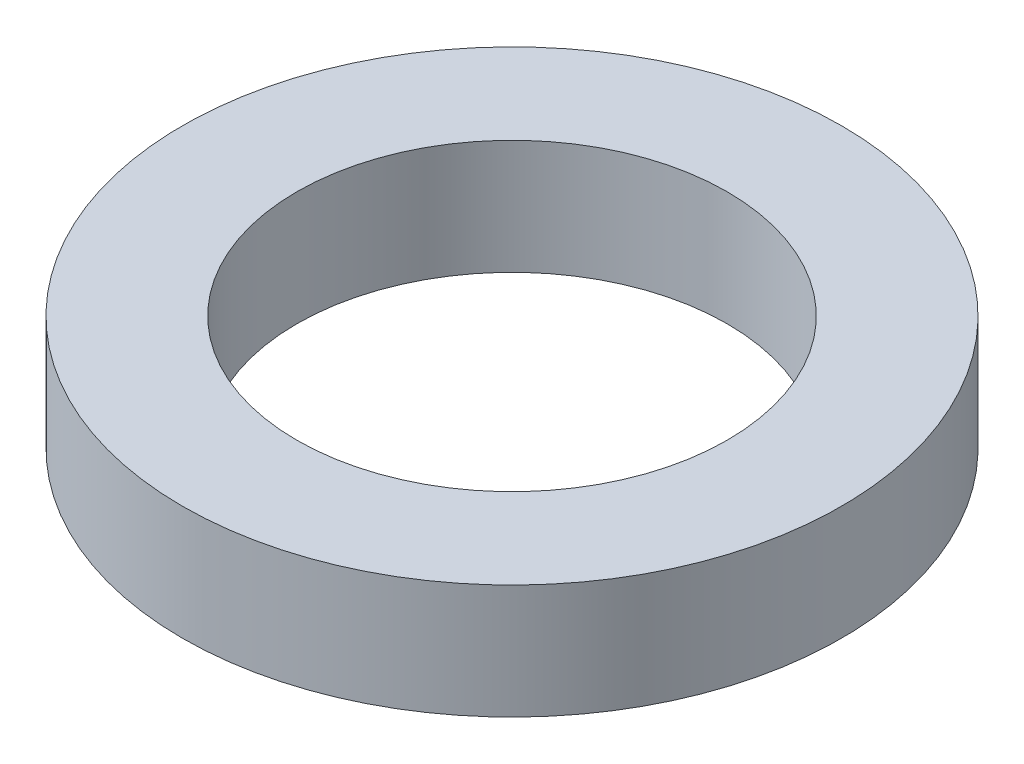
ISO-10303-21;
HEADER;
FILE_DESCRIPTION(('STEP AP214'),'2;1');
FILE_NAME('part.step','',(''),(''),'','','');
FILE_SCHEMA(('AUTOMOTIVE_DESIGN { 1 0 10303 214 1 1 1 1 }'));
ENDSEC;
DATA;
#1=APPLICATION_CONTEXT('core data for automotive mechanical design processes');
#2=APPLICATION_PROTOCOL_DEFINITION('international standard','automotive_design',2000,#1);
#3=PRODUCT_CONTEXT('',#1,'mechanical');
#4=PRODUCT('Part','Part','',(#3));
#5=PRODUCT_RELATED_PRODUCT_CATEGORY('part','',(#4));
#6=PRODUCT_DEFINITION_FORMATION('','',#4);
#7=PRODUCT_DEFINITION_CONTEXT('part definition',#1,'design');
#8=PRODUCT_DEFINITION('design','',#6,#7);
#9=PRODUCT_DEFINITION_SHAPE('','',#8);
#10=(LENGTH_UNIT() NAMED_UNIT(*) SI_UNIT(.MILLI.,.METRE.));
#11=(NAMED_UNIT(*) PLANE_ANGLE_UNIT() SI_UNIT($,.RADIAN.));
#12=(NAMED_UNIT(*) SI_UNIT($,.STERADIAN.) SOLID_ANGLE_UNIT());
#13=UNCERTAINTY_MEASURE_WITH_UNIT(LENGTH_MEASURE(1.E-05),#10,'distance_accuracy_value','');
#14=(GEOMETRIC_REPRESENTATION_CONTEXT(3) GLOBAL_UNCERTAINTY_ASSIGNED_CONTEXT((#13)) GLOBAL_UNIT_ASSIGNED_CONTEXT((#10,
#11,#12)) REPRESENTATION_CONTEXT('',''));
#15=CARTESIAN_POINT('',(0.,0.,0.));
#16=DIRECTION('',(0.,0.,1.));
#17=DIRECTION('',(1.,0.,0.));
#18=AXIS2_PLACEMENT_3D('',#15,#16,#17);
#19=CARTESIAN_POINT('',(0.,15.524,0.));
#20=DIRECTION('',(0.,1.,0.));
#21=DIRECTION('',(0.,0.,1.));
#22=AXIS2_PLACEMENT_3D('',#19,#20,#21);
#23=PLANE('',#22);
#24=CARTESIAN_POINT('',(0.,15.524,0.));
#25=DIRECTION('',(0.,1.,0.));
#26=DIRECTION('',(0.,0.,1.));
#27=AXIS2_PLACEMENT_3D('',#24,#25,#26);
#28=CIRCLE('',#27,44.734);
#29=CARTESIAN_POINT('',(0.,15.524,-44.734));
#30=VERTEX_POINT('',#29);
#31=EDGE_CURVE('E10',#30,#30,#28,.T.);
#32=ORIENTED_EDGE('',*,*,#31,.T.);
#33=EDGE_LOOP('',(#32));
#34=FACE_BOUND('',#33,.T.);
#35=CARTESIAN_POINT('',(0.,15.524,0.));
#36=DIRECTION('',(0.,1.,0.));
#37=DIRECTION('',(0.,0.,1.));
#38=AXIS2_PLACEMENT_3D('',#35,#36,#37);
#39=CIRCLE('',#38,29.21);
#40=CARTESIAN_POINT('',(0.,15.524,-29.21));
#41=VERTEX_POINT('',#40);
#42=EDGE_CURVE('E40',#41,#41,#39,.T.);
#43=ORIENTED_EDGE('',*,*,#42,.F.);
#44=EDGE_LOOP('',(#43));
#45=FACE_BOUND('',#44,.T.);
#46=ADVANCED_FACE('F29',(#34,#45),#23,.T.);
#47=CARTESIAN_POINT('',(0.,0.,0.));
#48=DIRECTION('',(0.,1.,0.));
#49=DIRECTION('',(0.,0.,1.));
#50=AXIS2_PLACEMENT_3D('',#47,#48,#49);
#51=PLANE('',#50);
#52=CARTESIAN_POINT('',(0.,0.,0.));
#53=DIRECTION('',(0.,1.,0.));
#54=DIRECTION('',(0.,0.,1.));
#55=AXIS2_PLACEMENT_3D('',#52,#53,#54);
#56=CIRCLE('',#55,44.734);
#57=CARTESIAN_POINT('',(0.,0.,-44.734));
#58=VERTEX_POINT('',#57);
#59=EDGE_CURVE('E33',#58,#58,#56,.T.);
#60=ORIENTED_EDGE('',*,*,#59,.F.);
#61=EDGE_LOOP('',(#60));
#62=FACE_BOUND('',#61,.T.);
#63=CARTESIAN_POINT('',(0.,0.,0.));
#64=DIRECTION('',(0.,1.,0.));
#65=DIRECTION('',(0.,0.,1.));
#66=AXIS2_PLACEMENT_3D('',#63,#64,#65);
#67=CIRCLE('',#66,29.21);
#68=CARTESIAN_POINT('',(0.,0.,-29.21));
#69=VERTEX_POINT('',#68);
#70=EDGE_CURVE('E42',#69,#69,#67,.T.);
#71=ORIENTED_EDGE('',*,*,#70,.T.);
#72=EDGE_LOOP('',(#71));
#73=FACE_BOUND('',#72,.T.);
#74=ADVANCED_FACE('F52',(#62,#73),#51,.F.);
#75=CARTESIAN_POINT('',(0.,15.524,0.));
#76=DIRECTION('',(0.,-1.,0.));
#77=DIRECTION('',(0.,0.,-1.));
#78=AXIS2_PLACEMENT_3D('',#75,#76,#77);
#79=CYLINDRICAL_SURFACE('',#78,44.734);
#80=CARTESIAN_POINT('',(0.,15.524,-44.734));
#81=CARTESIAN_POINT('',(0.,15.3622916666667,-44.734));
#82=CARTESIAN_POINT('',(0.,15.2005833333333,-44.734));
#83=CARTESIAN_POINT('',(0.,14.8771666666667,-44.734));
#84=CARTESIAN_POINT('',(0.,14.7154583333333,-44.734));
#85=CARTESIAN_POINT('',(0.,14.3920416666667,-44.734));
#86=CARTESIAN_POINT('',(0.,14.2303333333333,-44.734));
#87=CARTESIAN_POINT('',(0.,13.9069166666667,-44.734));
#88=CARTESIAN_POINT('',(0.,13.7452083333333,-44.734));
#89=CARTESIAN_POINT('',(0.,13.4217916666667,-44.734));
#90=CARTESIAN_POINT('',(0.,13.2600833333333,-44.734));
#91=CARTESIAN_POINT('',(0.,12.9366666666667,-44.734));
#92=CARTESIAN_POINT('',(0.,12.7749583333333,-44.734));
#93=CARTESIAN_POINT('',(0.,12.4515416666667,-44.734));
#94=CARTESIAN_POINT('',(0.,12.2898333333333,-44.734));
#95=CARTESIAN_POINT('',(0.,11.9664166666667,-44.734));
#96=CARTESIAN_POINT('',(0.,11.8047083333333,-44.734));
#97=CARTESIAN_POINT('',(0.,11.4812916666667,-44.734));
#98=CARTESIAN_POINT('',(0.,11.3195833333333,-44.734));
#99=CARTESIAN_POINT('',(0.,10.9961666666667,-44.734));
#100=CARTESIAN_POINT('',(0.,10.8344583333333,-44.734));
#101=CARTESIAN_POINT('',(0.,10.5110416666667,-44.734));
#102=CARTESIAN_POINT('',(0.,10.3493333333333,-44.734));
#103=CARTESIAN_POINT('',(0.,10.0259166666667,-44.734));
#104=CARTESIAN_POINT('',(0.,9.86420833333333,-44.734));
#105=CARTESIAN_POINT('',(0.,9.54079166666667,-44.734));
#106=CARTESIAN_POINT('',(0.,9.37908333333333,-44.734));
#107=CARTESIAN_POINT('',(0.,9.05566666666667,-44.734));
#108=CARTESIAN_POINT('',(0.,8.89395833333333,-44.734));
#109=CARTESIAN_POINT('',(0.,8.57054166666667,-44.734));
#110=CARTESIAN_POINT('',(0.,8.40883333333333,-44.734));
#111=CARTESIAN_POINT('',(0.,8.08541666666666,-44.734));
#112=CARTESIAN_POINT('',(0.,7.92370833333333,-44.734));
#113=CARTESIAN_POINT('',(0.,7.60029166666667,-44.734));
#114=CARTESIAN_POINT('',(0.,7.43858333333333,-44.734));
#115=CARTESIAN_POINT('',(0.,7.11516666666667,-44.734));
#116=CARTESIAN_POINT('',(0.,6.95345833333333,-44.734));
#117=CARTESIAN_POINT('',(0.,6.63004166666667,-44.734));
#118=CARTESIAN_POINT('',(0.,6.46833333333333,-44.734));
#119=CARTESIAN_POINT('',(0.,6.14491666666667,-44.734));
#120=CARTESIAN_POINT('',(0.,5.98320833333333,-44.734));
#121=CARTESIAN_POINT('',(0.,5.65979166666667,-44.734));
#122=CARTESIAN_POINT('',(0.,5.49808333333333,-44.734));
#123=CARTESIAN_POINT('',(0.,5.17466666666667,-44.734));
#124=CARTESIAN_POINT('',(0.,5.01295833333333,-44.734));
#125=CARTESIAN_POINT('',(0.,4.68954166666667,-44.734));
#126=CARTESIAN_POINT('',(0.,4.52783333333333,-44.734));
#127=CARTESIAN_POINT('',(0.,4.20441666666667,-44.734));
#128=CARTESIAN_POINT('',(0.,4.04270833333333,-44.734));
#129=CARTESIAN_POINT('',(0.,3.71929166666667,-44.734));
#130=CARTESIAN_POINT('',(0.,3.55758333333333,-44.734));
#131=CARTESIAN_POINT('',(0.,3.23416666666667,-44.734));
#132=CARTESIAN_POINT('',(0.,3.07245833333333,-44.734));
#133=CARTESIAN_POINT('',(0.,2.74904166666667,-44.734));
#134=CARTESIAN_POINT('',(0.,2.58733333333333,-44.734));
#135=CARTESIAN_POINT('',(0.,2.26391666666667,-44.734));
#136=CARTESIAN_POINT('',(0.,2.10220833333333,-44.734));
#137=CARTESIAN_POINT('',(0.,1.77879166666667,-44.734));
#138=CARTESIAN_POINT('',(0.,1.61708333333333,-44.734));
#139=CARTESIAN_POINT('',(0.,1.29366666666667,-44.734));
#140=CARTESIAN_POINT('',(0.,1.13195833333333,-44.734));
#141=CARTESIAN_POINT('',(0.,0.808541666666665,-44.734));
#142=CARTESIAN_POINT('',(0.,0.646833333333331,-44.734));
#143=CARTESIAN_POINT('',(0.,0.323416666666665,-44.734));
#144=CARTESIAN_POINT('',(0.,0.161708333333331,-44.734));
#145=CARTESIAN_POINT('',(0.,0.,-44.734));
#146=B_SPLINE_CURVE_WITH_KNOTS('',3,(#80,#81,#82,#83,#84,#85,#86,#87,#88,#89,#90,#91,#92,#93,
#94,#95,#96,#97,#98,#99,#100,#101,#102,#103,#104,#105,#106,#107,#108,#109,#110,#111,#112,#113,
#114,#115,#116,#117,#118,#119,#120,#121,#122,#123,#124,#125,#126,#127,#128,#129,#130,#131,#132,
#133,#134,#135,#136,#137,#138,#139,#140,#141,#142,#143,#144,#145),.UNSPECIFIED.,.F.,.F.,(4,2,2,
2,2,2,2,2,2,2,2,2,2,2,2,2,2,2,2,2,2,2,2,2,2,2,2,2,2,2,2,2,4),(0.,0.485125000000001,
0.970250000000001,1.455375,1.9405,2.425625,2.91075,3.395875,3.881,4.366125,4.85125,5.336375,
5.8215,6.306625,6.79175,7.276875,7.762,8.247125,8.73225,9.217375,9.7025,10.187625,10.67275,
11.157875,11.643,12.128125,12.61325,13.098375,13.5835,14.068625,14.55375,15.038875,15.524),.UNSPECIFIED.);
#147=EDGE_CURVE('BSEAM31',#30,#58,#146,.T.);
#148=ORIENTED_EDGE('',*,*,#31,.F.);
#149=ORIENTED_EDGE('',*,*,#59,.T.);
#150=ORIENTED_EDGE('',*,*,#147,.T.);
#151=ORIENTED_EDGE('',*,*,#147,.F.);
#152=EDGE_LOOP('',(#148,#150,#149,#151));
#153=FACE_BOUND('',#152,.T.);
#154=ADVANCED_FACE('F31',(#153),#79,.T.);
#155=CARTESIAN_POINT('',(0.,15.524,0.));
#156=DIRECTION('',(0.,-1.,0.));
#157=DIRECTION('',(0.,0.,-1.));
#158=AXIS2_PLACEMENT_3D('',#155,#156,#157);
#159=CYLINDRICAL_SURFACE('',#158,29.21);
#160=CARTESIAN_POINT('',(0.,15.524,-29.21));
#161=CARTESIAN_POINT('',(0.,15.3622916666667,-29.21));
#162=CARTESIAN_POINT('',(0.,15.2005833333333,-29.21));
#163=CARTESIAN_POINT('',(0.,14.8771666666667,-29.21));
#164=CARTESIAN_POINT('',(0.,14.7154583333333,-29.21));
#165=CARTESIAN_POINT('',(0.,14.3920416666667,-29.21));
#166=CARTESIAN_POINT('',(0.,14.2303333333333,-29.21));
#167=CARTESIAN_POINT('',(0.,13.9069166666667,-29.21));
#168=CARTESIAN_POINT('',(0.,13.7452083333333,-29.21));
#169=CARTESIAN_POINT('',(0.,13.4217916666667,-29.21));
#170=CARTESIAN_POINT('',(0.,13.2600833333333,-29.21));
#171=CARTESIAN_POINT('',(0.,12.9366666666667,-29.21));
#172=CARTESIAN_POINT('',(0.,12.7749583333333,-29.21));
#173=CARTESIAN_POINT('',(0.,12.4515416666667,-29.21));
#174=CARTESIAN_POINT('',(0.,12.2898333333333,-29.21));
#175=CARTESIAN_POINT('',(0.,11.9664166666667,-29.21));
#176=CARTESIAN_POINT('',(0.,11.8047083333333,-29.21));
#177=CARTESIAN_POINT('',(0.,11.4812916666667,-29.21));
#178=CARTESIAN_POINT('',(0.,11.3195833333333,-29.21));
#179=CARTESIAN_POINT('',(0.,10.9961666666667,-29.21));
#180=CARTESIAN_POINT('',(0.,10.8344583333333,-29.21));
#181=CARTESIAN_POINT('',(0.,10.5110416666667,-29.21));
#182=CARTESIAN_POINT('',(0.,10.3493333333333,-29.21));
#183=CARTESIAN_POINT('',(0.,10.0259166666667,-29.21));
#184=CARTESIAN_POINT('',(0.,9.86420833333333,-29.21));
#185=CARTESIAN_POINT('',(0.,9.54079166666667,-29.21));
#186=CARTESIAN_POINT('',(0.,9.37908333333333,-29.21));
#187=CARTESIAN_POINT('',(0.,9.05566666666667,-29.21));
#188=CARTESIAN_POINT('',(0.,8.89395833333333,-29.21));
#189=CARTESIAN_POINT('',(0.,8.57054166666667,-29.21));
#190=CARTESIAN_POINT('',(0.,8.40883333333333,-29.21));
#191=CARTESIAN_POINT('',(0.,8.08541666666666,-29.21));
#192=CARTESIAN_POINT('',(0.,7.92370833333333,-29.21));
#193=CARTESIAN_POINT('',(0.,7.60029166666667,-29.21));
#194=CARTESIAN_POINT('',(0.,7.43858333333333,-29.21));
#195=CARTESIAN_POINT('',(0.,7.11516666666667,-29.21));
#196=CARTESIAN_POINT('',(0.,6.95345833333333,-29.21));
#197=CARTESIAN_POINT('',(0.,6.63004166666667,-29.21));
#198=CARTESIAN_POINT('',(0.,6.46833333333333,-29.21));
#199=CARTESIAN_POINT('',(0.,6.14491666666667,-29.21));
#200=CARTESIAN_POINT('',(0.,5.98320833333333,-29.21));
#201=CARTESIAN_POINT('',(0.,5.65979166666667,-29.21));
#202=CARTESIAN_POINT('',(0.,5.49808333333333,-29.21));
#203=CARTESIAN_POINT('',(0.,5.17466666666667,-29.21));
#204=CARTESIAN_POINT('',(0.,5.01295833333333,-29.21));
#205=CARTESIAN_POINT('',(0.,4.68954166666667,-29.21));
#206=CARTESIAN_POINT('',(0.,4.52783333333333,-29.21));
#207=CARTESIAN_POINT('',(0.,4.20441666666667,-29.21));
#208=CARTESIAN_POINT('',(0.,4.04270833333333,-29.21));
#209=CARTESIAN_POINT('',(0.,3.71929166666667,-29.21));
#210=CARTESIAN_POINT('',(0.,3.55758333333333,-29.21));
#211=CARTESIAN_POINT('',(0.,3.23416666666667,-29.21));
#212=CARTESIAN_POINT('',(0.,3.07245833333333,-29.21));
#213=CARTESIAN_POINT('',(0.,2.74904166666667,-29.21));
#214=CARTESIAN_POINT('',(0.,2.58733333333333,-29.21));
#215=CARTESIAN_POINT('',(0.,2.26391666666667,-29.21));
#216=CARTESIAN_POINT('',(0.,2.10220833333333,-29.21));
#217=CARTESIAN_POINT('',(0.,1.77879166666667,-29.21));
#218=CARTESIAN_POINT('',(0.,1.61708333333333,-29.21));
#219=CARTESIAN_POINT('',(0.,1.29366666666667,-29.21));
#220=CARTESIAN_POINT('',(0.,1.13195833333333,-29.21));
#221=CARTESIAN_POINT('',(0.,0.808541666666665,-29.21));
#222=CARTESIAN_POINT('',(0.,0.646833333333331,-29.21));
#223=CARTESIAN_POINT('',(0.,0.323416666666665,-29.21));
#224=CARTESIAN_POINT('',(0.,0.161708333333331,-29.21));
#225=CARTESIAN_POINT('',(0.,0.,-29.21));
#226=B_SPLINE_CURVE_WITH_KNOTS('',3,(#160,#161,#162,#163,#164,#165,#166,#167,#168,#169,#170,
#171,#172,#173,#174,#175,#176,#177,#178,#179,#180,#181,#182,#183,#184,#185,#186,#187,#188,#189,
#190,#191,#192,#193,#194,#195,#196,#197,#198,#199,#200,#201,#202,#203,#204,#205,#206,#207,#208,
#209,#210,#211,#212,#213,#214,#215,#216,#217,#218,#219,#220,#221,#222,#223,#224,#225),
.UNSPECIFIED.,.F.,.F.,(4,2,2,2,2,2,2,2,2,2,2,2,2,2,2,2,2,2,2,2,2,2,2,2,2,2,2,2,2,2,2,2,4),(0.,
0.485125000000001,0.970250000000001,1.455375,1.9405,2.425625,2.91075,3.395875,3.881,4.366125,
4.85125,5.336375,5.8215,6.306625,6.79175,7.276875,7.762,8.247125,8.73225,9.217375,9.7025,
10.187625,10.67275,11.157875,11.643,12.128125,12.61325,13.098375,13.5835,14.068625,14.55375,
15.038875,15.524),.UNSPECIFIED.);
#227=EDGE_CURVE('BSEAM48',#41,#69,#226,.T.);
#228=ORIENTED_EDGE('',*,*,#42,.T.);
#229=ORIENTED_EDGE('',*,*,#70,.F.);
#230=ORIENTED_EDGE('',*,*,#227,.T.);
#231=ORIENTED_EDGE('',*,*,#227,.F.);
#232=EDGE_LOOP('',(#228,#230,#229,#231));
#233=FACE_BOUND('',#232,.T.);
#234=ADVANCED_FACE('F48',(#233),#159,.F.);
#235=CLOSED_SHELL('',(#46,#74,#154,#234));
#236=MANIFOLD_SOLID_BREP('B2',#235);
#237=ADVANCED_BREP_SHAPE_REPRESENTATION('',(#18,#236),#14);
#238=SHAPE_DEFINITION_REPRESENTATION(#9,#237);
ENDSEC;
END-ISO-10303-21;
